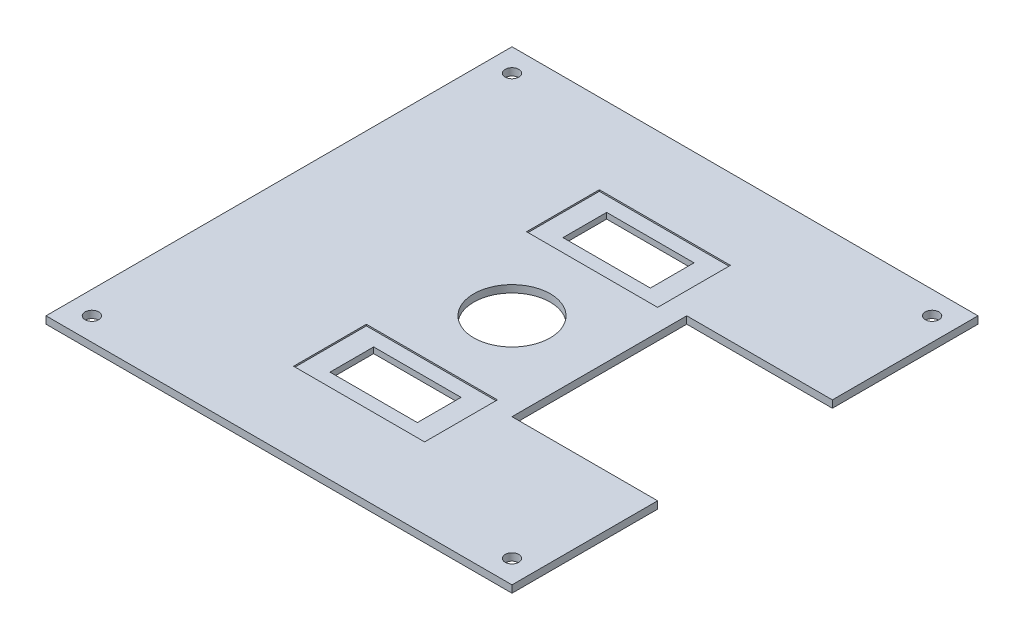
ISO-10303-21;
HEADER;
FILE_DESCRIPTION(('STEP AP214'),'2;1');
FILE_NAME('part.step','',(''),(''),'','','');
FILE_SCHEMA(('AUTOMOTIVE_DESIGN { 1 0 10303 214 1 1 1 1 }'));
ENDSEC;
DATA;
#1=APPLICATION_CONTEXT('core data for automotive mechanical design processes');
#2=APPLICATION_PROTOCOL_DEFINITION('international standard','automotive_design',2000,#1);
#3=PRODUCT_CONTEXT('',#1,'mechanical');
#4=PRODUCT('Part','Part','',(#3));
#5=PRODUCT_RELATED_PRODUCT_CATEGORY('part','',(#4));
#6=PRODUCT_DEFINITION_FORMATION('','',#4);
#7=PRODUCT_DEFINITION_CONTEXT('part definition',#1,'design');
#8=PRODUCT_DEFINITION('design','',#6,#7);
#9=PRODUCT_DEFINITION_SHAPE('','',#8);
#10=(LENGTH_UNIT() NAMED_UNIT(*) SI_UNIT(.MILLI.,.METRE.));
#11=(NAMED_UNIT(*) PLANE_ANGLE_UNIT() SI_UNIT($,.RADIAN.));
#12=(NAMED_UNIT(*) SI_UNIT($,.STERADIAN.) SOLID_ANGLE_UNIT());
#13=UNCERTAINTY_MEASURE_WITH_UNIT(LENGTH_MEASURE(1.E-05),#10,'distance_accuracy_value','');
#14=(GEOMETRIC_REPRESENTATION_CONTEXT(3) GLOBAL_UNCERTAINTY_ASSIGNED_CONTEXT((#13)) GLOBAL_UNIT_ASSIGNED_CONTEXT((#10,
#11,#12)) REPRESENTATION_CONTEXT('',''));
#15=CARTESIAN_POINT('',(0.,0.,0.));
#16=DIRECTION('',(0.,0.,1.));
#17=DIRECTION('',(1.,0.,0.));
#18=AXIS2_PLACEMENT_3D('',#15,#16,#17);
#19=CARTESIAN_POINT('',(-28.575,2.54,-34.925));
#20=DIRECTION('',(-1.,0.,0.));
#21=DIRECTION('',(0.,0.,1.));
#22=AXIS2_PLACEMENT_3D('',#19,#20,#21);
#23=PLANE('',#22);
#24=DIRECTION('',(0.,1.,0.));
#25=VECTOR('',#24,1.);
#26=CARTESIAN_POINT('',(-28.575,2.54,-34.925));
#27=LINE('',#26,#25);
#28=CARTESIAN_POINT('',(-28.575,3.175,-34.925));
#29=VERTEX_POINT('',#28);
#30=CARTESIAN_POINT('',(-28.575,2.54,-34.925));
#31=VERTEX_POINT('',#30);
#32=EDGE_CURVE('E181',#29,#31,#27,.F.);
#33=ORIENTED_EDGE('',*,*,#32,.T.);
#34=DIRECTION('',(0.,0.,-1.));
#35=VECTOR('',#34,1.);
#36=CARTESIAN_POINT('',(-28.575,2.54,0.));
#37=LINE('',#36,#35);
#38=CARTESIAN_POINT('',(-28.575,2.54,-66.675));
#39=VERTEX_POINT('',#38);
#40=EDGE_CURVE('E183',#31,#39,#37,.T.);
#41=ORIENTED_EDGE('',*,*,#40,.T.);
#42=DIRECTION('',(0.,1.,0.));
#43=VECTOR('',#42,1.);
#44=CARTESIAN_POINT('',(-28.575,2.54,-66.675));
#45=LINE('',#44,#43);
#46=CARTESIAN_POINT('',(-28.575,3.175,-66.675));
#47=VERTEX_POINT('',#46);
#48=EDGE_CURVE('E213',#39,#47,#45,.T.);
#49=ORIENTED_EDGE('',*,*,#48,.T.);
#50=DIRECTION('',(0.,0.,-1.));
#51=VECTOR('',#50,1.);
#52=CARTESIAN_POINT('',(-28.575,3.175,0.));
#53=LINE('',#52,#51);
#54=EDGE_CURVE('E186',#47,#29,#53,.F.);
#55=ORIENTED_EDGE('',*,*,#54,.T.);
#56=EDGE_LOOP('',(#33,#41,#49,#55));
#57=FACE_BOUND('',#56,.T.);
#58=ADVANCED_FACE('F17',(#57),#23,.F.);
#59=CARTESIAN_POINT('',(-28.575,2.54,-34.925));
#60=DIRECTION('',(0.,0.,1.));
#61=DIRECTION('',(1.,0.,0.));
#62=AXIS2_PLACEMENT_3D('',#59,#60,#61);
#63=PLANE('',#62);
#64=DIRECTION('',(0.,1.,0.));
#65=VECTOR('',#64,1.);
#66=CARTESIAN_POINT('',(28.575,2.54,-34.925));
#67=LINE('',#66,#65);
#68=CARTESIAN_POINT('',(28.575,3.175,-34.925));
#69=VERTEX_POINT('',#68);
#70=CARTESIAN_POINT('',(28.575,2.54,-34.925));
#71=VERTEX_POINT('',#70);
#72=EDGE_CURVE('E176',#69,#71,#67,.F.);
#73=ORIENTED_EDGE('',*,*,#72,.T.);
#74=DIRECTION('',(1.,0.,0.));
#75=VECTOR('',#74,1.);
#76=CARTESIAN_POINT('',(0.,2.54,-34.925));
#77=LINE('',#76,#75);
#78=EDGE_CURVE('E190',#71,#31,#77,.F.);
#79=ORIENTED_EDGE('',*,*,#78,.T.);
#80=ORIENTED_EDGE('',*,*,#32,.F.);
#81=DIRECTION('',(1.,0.,0.));
#82=VECTOR('',#81,1.);
#83=CARTESIAN_POINT('',(0.,3.175,-34.925));
#84=LINE('',#83,#82);
#85=EDGE_CURVE('E271',#29,#69,#84,.T.);
#86=ORIENTED_EDGE('',*,*,#85,.T.);
#87=EDGE_LOOP('',(#73,#79,#80,#86));
#88=FACE_BOUND('',#87,.T.);
#89=ADVANCED_FACE('F191',(#88),#63,.F.);
#90=CARTESIAN_POINT('',(28.575,2.54,-34.925));
#91=DIRECTION('',(1.,0.,0.));
#92=DIRECTION('',(0.,0.,-1.));
#93=AXIS2_PLACEMENT_3D('',#90,#91,#92);
#94=PLANE('',#93);
#95=DIRECTION('',(0.,1.,0.));
#96=VECTOR('',#95,1.);
#97=CARTESIAN_POINT('',(28.575,2.54,-66.675));
#98=LINE('',#97,#96);
#99=CARTESIAN_POINT('',(28.575,3.175,-66.675));
#100=VERTEX_POINT('',#99);
#101=CARTESIAN_POINT('',(28.575,2.54,-66.675));
#102=VERTEX_POINT('',#101);
#103=EDGE_CURVE('E215',#100,#102,#98,.F.);
#104=ORIENTED_EDGE('',*,*,#103,.T.);
#105=DIRECTION('',(0.,0.,-1.));
#106=VECTOR('',#105,1.);
#107=CARTESIAN_POINT('',(28.575,2.54,0.));
#108=LINE('',#107,#106);
#109=EDGE_CURVE('E202',#102,#71,#108,.F.);
#110=ORIENTED_EDGE('',*,*,#109,.T.);
#111=ORIENTED_EDGE('',*,*,#72,.F.);
#112=DIRECTION('',(0.,0.,-1.));
#113=VECTOR('',#112,1.);
#114=CARTESIAN_POINT('',(28.575,3.175,0.));
#115=LINE('',#114,#113);
#116=EDGE_CURVE('E269',#69,#100,#115,.T.);
#117=ORIENTED_EDGE('',*,*,#116,.T.);
#118=EDGE_LOOP('',(#104,#110,#111,#117));
#119=FACE_BOUND('',#118,.T.);
#120=ADVANCED_FACE('F285',(#119),#94,.F.);
#121=CARTESIAN_POINT('',(-28.575,2.54,-66.675));
#122=DIRECTION('',(0.,0.,-1.));
#123=DIRECTION('',(-1.,0.,0.));
#124=AXIS2_PLACEMENT_3D('',#121,#122,#123);
#125=PLANE('',#124);
#126=ORIENTED_EDGE('',*,*,#48,.F.);
#127=DIRECTION('',(1.,0.,0.));
#128=VECTOR('',#127,1.);
#129=CARTESIAN_POINT('',(0.,2.54,-66.675));
#130=LINE('',#129,#128);
#131=EDGE_CURVE('E200',#39,#102,#130,.T.);
#132=ORIENTED_EDGE('',*,*,#131,.T.);
#133=ORIENTED_EDGE('',*,*,#103,.F.);
#134=DIRECTION('',(1.,0.,0.));
#135=VECTOR('',#134,1.);
#136=CARTESIAN_POINT('',(0.,3.175,-66.675));
#137=LINE('',#136,#135);
#138=EDGE_CURVE('E266',#100,#47,#137,.F.);
#139=ORIENTED_EDGE('',*,*,#138,.T.);
#140=EDGE_LOOP('',(#126,#132,#133,#139));
#141=FACE_BOUND('',#140,.T.);
#142=ADVANCED_FACE('F290',(#141),#125,.F.);
#143=CARTESIAN_POINT('',(-28.575,2.54,66.675));
#144=DIRECTION('',(0.,0.,1.));
#145=DIRECTION('',(1.,0.,0.));
#146=AXIS2_PLACEMENT_3D('',#143,#144,#145);
#147=PLANE('',#146);
#148=DIRECTION('',(0.,1.,0.));
#149=VECTOR('',#148,1.);
#150=CARTESIAN_POINT('',(28.575,2.54,66.675));
#151=LINE('',#150,#149);
#152=CARTESIAN_POINT('',(28.575,3.175,66.675));
#153=VERTEX_POINT('',#152);
#154=CARTESIAN_POINT('',(28.575,2.54,66.675));
#155=VERTEX_POINT('',#154);
#156=EDGE_CURVE('E211',#153,#155,#151,.F.);
#157=ORIENTED_EDGE('',*,*,#156,.T.);
#158=DIRECTION('',(1.,0.,0.));
#159=VECTOR('',#158,1.);
#160=CARTESIAN_POINT('',(0.,2.54,66.675));
#161=LINE('',#160,#159);
#162=CARTESIAN_POINT('',(-28.575,2.54,66.675));
#163=VERTEX_POINT('',#162);
#164=EDGE_CURVE('E280',#155,#163,#161,.F.);
#165=ORIENTED_EDGE('',*,*,#164,.T.);
#166=DIRECTION('',(0.,1.,0.));
#167=VECTOR('',#166,1.);
#168=CARTESIAN_POINT('',(-28.575,2.54,66.675));
#169=LINE('',#168,#167);
#170=CARTESIAN_POINT('',(-28.575,3.175,66.675));
#171=VERTEX_POINT('',#170);
#172=EDGE_CURVE('E194',#163,#171,#169,.T.);
#173=ORIENTED_EDGE('',*,*,#172,.T.);
#174=DIRECTION('',(1.,0.,0.));
#175=VECTOR('',#174,1.);
#176=CARTESIAN_POINT('',(0.,3.175,66.675));
#177=LINE('',#176,#175);
#178=EDGE_CURVE('E264',#171,#153,#177,.T.);
#179=ORIENTED_EDGE('',*,*,#178,.T.);
#180=EDGE_LOOP('',(#157,#165,#173,#179));
#181=FACE_BOUND('',#180,.T.);
#182=ADVANCED_FACE('F508',(#181),#147,.F.);
#183=CARTESIAN_POINT('',(28.575,2.54,34.925));
#184=DIRECTION('',(1.,0.,0.));
#185=DIRECTION('',(0.,0.,-1.));
#186=AXIS2_PLACEMENT_3D('',#183,#184,#185);
#187=PLANE('',#186);
#188=DIRECTION('',(0.,1.,0.));
#189=VECTOR('',#188,1.);
#190=CARTESIAN_POINT('',(28.575,2.54,34.925));
#191=LINE('',#190,#189);
#192=CARTESIAN_POINT('',(28.575,3.175,34.925));
#193=VERTEX_POINT('',#192);
#194=CARTESIAN_POINT('',(28.575,2.54,34.925));
#195=VERTEX_POINT('',#194);
#196=EDGE_CURVE('E209',#193,#195,#191,.F.);
#197=ORIENTED_EDGE('',*,*,#196,.T.);
#198=DIRECTION('',(0.,0.,-1.));
#199=VECTOR('',#198,1.);
#200=CARTESIAN_POINT('',(28.575,2.54,0.));
#201=LINE('',#200,#199);
#202=EDGE_CURVE('E282',#195,#155,#201,.F.);
#203=ORIENTED_EDGE('',*,*,#202,.T.);
#204=ORIENTED_EDGE('',*,*,#156,.F.);
#205=DIRECTION('',(0.,0.,-1.));
#206=VECTOR('',#205,1.);
#207=CARTESIAN_POINT('',(28.575,3.175,0.));
#208=LINE('',#207,#206);
#209=EDGE_CURVE('E258',#153,#193,#208,.T.);
#210=ORIENTED_EDGE('',*,*,#209,.T.);
#211=EDGE_LOOP('',(#197,#203,#204,#210));
#212=FACE_BOUND('',#211,.T.);
#213=ADVANCED_FACE('F504',(#212),#187,.F.);
#214=CARTESIAN_POINT('',(-28.575,2.54,34.925));
#215=DIRECTION('',(0.,0.,-1.));
#216=DIRECTION('',(-1.,0.,0.));
#217=AXIS2_PLACEMENT_3D('',#214,#215,#216);
#218=PLANE('',#217);
#219=DIRECTION('',(0.,1.,0.));
#220=VECTOR('',#219,1.);
#221=CARTESIAN_POINT('',(-28.575,2.54,34.925));
#222=LINE('',#221,#220);
#223=CARTESIAN_POINT('',(-28.575,3.175,34.925));
#224=VERTEX_POINT('',#223);
#225=CARTESIAN_POINT('',(-28.575,2.54,34.925));
#226=VERTEX_POINT('',#225);
#227=EDGE_CURVE('E207',#224,#226,#222,.F.);
#228=ORIENTED_EDGE('',*,*,#227,.T.);
#229=DIRECTION('',(1.,0.,0.));
#230=VECTOR('',#229,1.);
#231=CARTESIAN_POINT('',(0.,2.54,34.925));
#232=LINE('',#231,#230);
#233=EDGE_CURVE('E274',#226,#195,#232,.T.);
#234=ORIENTED_EDGE('',*,*,#233,.T.);
#235=ORIENTED_EDGE('',*,*,#196,.F.);
#236=DIRECTION('',(1.,0.,0.));
#237=VECTOR('',#236,1.);
#238=CARTESIAN_POINT('',(0.,3.175,34.925));
#239=LINE('',#238,#237);
#240=EDGE_CURVE('E251',#193,#224,#239,.F.);
#241=ORIENTED_EDGE('',*,*,#240,.T.);
#242=EDGE_LOOP('',(#228,#234,#235,#241));
#243=FACE_BOUND('',#242,.T.);
#244=ADVANCED_FACE('F499',(#243),#218,.F.);
#245=CARTESIAN_POINT('',(-28.575,2.54,34.925));
#246=DIRECTION('',(-1.,0.,0.));
#247=DIRECTION('',(0.,0.,1.));
#248=AXIS2_PLACEMENT_3D('',#245,#246,#247);
#249=PLANE('',#248);
#250=ORIENTED_EDGE('',*,*,#172,.F.);
#251=DIRECTION('',(0.,0.,-1.));
#252=VECTOR('',#251,1.);
#253=CARTESIAN_POINT('',(-28.575,2.54,0.));
#254=LINE('',#253,#252);
#255=EDGE_CURVE('E277',#163,#226,#254,.T.);
#256=ORIENTED_EDGE('',*,*,#255,.T.);
#257=ORIENTED_EDGE('',*,*,#227,.F.);
#258=DIRECTION('',(0.,0.,-1.));
#259=VECTOR('',#258,1.);
#260=CARTESIAN_POINT('',(-28.575,3.175,0.));
#261=LINE('',#260,#259);
#262=EDGE_CURVE('E247',#224,#171,#261,.F.);
#263=ORIENTED_EDGE('',*,*,#262,.T.);
#264=EDGE_LOOP('',(#250,#256,#257,#263));
#265=FACE_BOUND('',#264,.T.);
#266=ADVANCED_FACE('F491',(#265),#249,.F.);
#267=CARTESIAN_POINT('',(0.,2.54,0.));
#268=DIRECTION('',(0.,-1.,0.));
#269=DIRECTION('',(0.,0.,-1.));
#270=AXIS2_PLACEMENT_3D('',#267,#268,#269);
#271=PLANE('',#270);
#272=ORIENTED_EDGE('',*,*,#131,.F.);
#273=ORIENTED_EDGE('',*,*,#40,.F.);
#274=ORIENTED_EDGE('',*,*,#78,.F.);
#275=ORIENTED_EDGE('',*,*,#109,.F.);
#276=EDGE_LOOP('',(#272,#273,#274,#275));
#277=FACE_BOUND('',#276,.T.);
#278=DIRECTION('',(0.,0.,-1.));
#279=VECTOR('',#278,1.);
#280=CARTESIAN_POINT('',(19.05,2.54,-41.275));
#281=LINE('',#280,#279);
#282=CARTESIAN_POINT('',(19.05,2.54,-60.325));
#283=VERTEX_POINT('',#282);
#284=CARTESIAN_POINT('',(19.05,2.54,-41.275));
#285=VERTEX_POINT('',#284);
#286=EDGE_CURVE('E239',#283,#285,#281,.F.);
#287=ORIENTED_EDGE('',*,*,#286,.T.);
#288=DIRECTION('',(1.,0.,0.));
#289=VECTOR('',#288,1.);
#290=CARTESIAN_POINT('',(-19.05,2.54,-41.275));
#291=LINE('',#290,#289);
#292=CARTESIAN_POINT('',(-19.05,2.54,-41.275));
#293=VERTEX_POINT('',#292);
#294=EDGE_CURVE('E413',#285,#293,#291,.F.);
#295=ORIENTED_EDGE('',*,*,#294,.T.);
#296=DIRECTION('',(0.,0.,1.));
#297=VECTOR('',#296,1.);
#298=CARTESIAN_POINT('',(-19.05,2.54,-41.275));
#299=LINE('',#298,#297);
#300=CARTESIAN_POINT('',(-19.05,2.54,-60.325));
#301=VERTEX_POINT('',#300);
#302=EDGE_CURVE('E484',#293,#301,#299,.F.);
#303=ORIENTED_EDGE('',*,*,#302,.T.);
#304=DIRECTION('',(-1.,0.,0.));
#305=VECTOR('',#304,1.);
#306=CARTESIAN_POINT('',(-19.05,2.54,-60.325));
#307=LINE('',#306,#305);
#308=EDGE_CURVE('E486',#301,#283,#307,.F.);
#309=ORIENTED_EDGE('',*,*,#308,.T.);
#310=EDGE_LOOP('',(#287,#295,#303,#309));
#311=FACE_BOUND('',#310,.T.);
#312=ADVANCED_FACE('F197',(#277,#311),#271,.F.);
#313=CARTESIAN_POINT('',(0.,2.54,0.));
#314=DIRECTION('',(0.,-1.,0.));
#315=DIRECTION('',(0.,0.,-1.));
#316=AXIS2_PLACEMENT_3D('',#313,#314,#315);
#317=PLANE('',#316);
#318=ORIENTED_EDGE('',*,*,#255,.F.);
#319=ORIENTED_EDGE('',*,*,#164,.F.);
#320=ORIENTED_EDGE('',*,*,#202,.F.);
#321=ORIENTED_EDGE('',*,*,#233,.F.);
#322=EDGE_LOOP('',(#318,#319,#320,#321));
#323=FACE_BOUND('',#322,.T.);
#324=DIRECTION('',(-1.,0.,0.));
#325=VECTOR('',#324,1.);
#326=CARTESIAN_POINT('',(-19.05,2.54,41.275));
#327=LINE('',#326,#325);
#328=CARTESIAN_POINT('',(-19.05,2.54,41.275));
#329=VERTEX_POINT('',#328);
#330=CARTESIAN_POINT('',(19.05,2.54,41.275));
#331=VERTEX_POINT('',#330);
#332=EDGE_CURVE('E414',#329,#331,#327,.F.);
#333=ORIENTED_EDGE('',*,*,#332,.T.);
#334=DIRECTION('',(0.,0.,-1.));
#335=VECTOR('',#334,1.);
#336=CARTESIAN_POINT('',(19.05,2.54,41.275));
#337=LINE('',#336,#335);
#338=CARTESIAN_POINT('',(19.05,2.54,60.3250000000001));
#339=VERTEX_POINT('',#338);
#340=EDGE_CURVE('E469',#331,#339,#337,.F.);
#341=ORIENTED_EDGE('',*,*,#340,.T.);
#342=DIRECTION('',(1.,0.,0.));
#343=VECTOR('',#342,1.);
#344=CARTESIAN_POINT('',(-19.05,2.54,60.3250000000001));
#345=LINE('',#344,#343);
#346=CARTESIAN_POINT('',(-19.05,2.54,60.3250000000001));
#347=VERTEX_POINT('',#346);
#348=EDGE_CURVE('E473',#339,#347,#345,.F.);
#349=ORIENTED_EDGE('',*,*,#348,.T.);
#350=DIRECTION('',(0.,0.,1.));
#351=VECTOR('',#350,1.);
#352=CARTESIAN_POINT('',(-19.05,2.54,41.275));
#353=LINE('',#352,#351);
#354=EDGE_CURVE('E477',#347,#329,#353,.F.);
#355=ORIENTED_EDGE('',*,*,#354,.T.);
#356=EDGE_LOOP('',(#333,#341,#349,#355));
#357=FACE_BOUND('',#356,.T.);
#358=ADVANCED_FACE('F296',(#323,#357),#317,.F.);
#359=CARTESIAN_POINT('',(0.,3.175,0.));
#360=DIRECTION('',(0.,-1.,0.));
#361=DIRECTION('',(0.,0.,-1.));
#362=AXIS2_PLACEMENT_3D('',#359,#360,#361);
#363=PLANE('',#362);
#364=CARTESIAN_POINT('',(0.,3.175,0.));
#365=DIRECTION('',(0.,-1.,0.));
#366=DIRECTION('',(0.,0.,-1.));
#367=AXIS2_PLACEMENT_3D('',#364,#365,#366);
#368=CIRCLE('',#367,16.66875);
#369=CARTESIAN_POINT('',(0.,3.175,-16.66875));
#370=VERTEX_POINT('',#369);
#371=EDGE_CURVE('E231',#370,#370,#368,.T.);
#372=ORIENTED_EDGE('',*,*,#371,.T.);
#373=EDGE_LOOP('',(#372));
#374=FACE_BOUND('',#373,.T.);
#375=DIRECTION('',(-1.,0.,0.));
#376=VECTOR('',#375,1.);
#377=CARTESIAN_POINT('',(38.1,3.175,-38.1));
#378=LINE('',#377,#376);
#379=CARTESIAN_POINT('',(38.1,3.175,-38.1));
#380=VERTEX_POINT('',#379);
#381=CARTESIAN_POINT('',(101.6,3.175,-38.1));
#382=VERTEX_POINT('',#381);
#383=EDGE_CURVE('E462',#380,#382,#378,.F.);
#384=ORIENTED_EDGE('',*,*,#383,.T.);
#385=DIRECTION('',(0.,0.,1.));
#386=VECTOR('',#385,1.);
#387=CARTESIAN_POINT('',(101.6,3.175,101.6));
#388=LINE('',#387,#386);
#389=CARTESIAN_POINT('',(101.6,3.175,-101.6));
#390=VERTEX_POINT('',#389);
#391=EDGE_CURVE('E235',#382,#390,#388,.F.);
#392=ORIENTED_EDGE('',*,*,#391,.T.);
#393=DIRECTION('',(1.,0.,0.));
#394=VECTOR('',#393,1.);
#395=CARTESIAN_POINT('',(-101.6,3.175,-101.6));
#396=LINE('',#395,#394);
#397=CARTESIAN_POINT('',(-101.6,3.175,-101.6));
#398=VERTEX_POINT('',#397);
#399=EDGE_CURVE('E437',#390,#398,#396,.F.);
#400=ORIENTED_EDGE('',*,*,#399,.T.);
#401=DIRECTION('',(0.,0.,-1.));
#402=VECTOR('',#401,1.);
#403=CARTESIAN_POINT('',(-101.6,3.175,101.6));
#404=LINE('',#403,#402);
#405=CARTESIAN_POINT('',(-101.6,3.175,101.6));
#406=VERTEX_POINT('',#405);
#407=EDGE_CURVE('E441',#398,#406,#404,.F.);
#408=ORIENTED_EDGE('',*,*,#407,.T.);
#409=DIRECTION('',(-1.,0.,0.));
#410=VECTOR('',#409,1.);
#411=CARTESIAN_POINT('',(-101.6,3.175,101.6));
#412=LINE('',#411,#410);
#413=CARTESIAN_POINT('',(101.6,3.175,101.6));
#414=VERTEX_POINT('',#413);
#415=EDGE_CURVE('E445',#406,#414,#412,.F.);
#416=ORIENTED_EDGE('',*,*,#415,.T.);
#417=DIRECTION('',(0.,0.,1.));
#418=VECTOR('',#417,1.);
#419=CARTESIAN_POINT('',(101.6,3.175,101.6));
#420=LINE('',#419,#418);
#421=CARTESIAN_POINT('',(101.6,3.175,38.1));
#422=VERTEX_POINT('',#421);
#423=EDGE_CURVE('E449',#414,#422,#420,.F.);
#424=ORIENTED_EDGE('',*,*,#423,.T.);
#425=DIRECTION('',(1.,0.,0.));
#426=VECTOR('',#425,1.);
#427=CARTESIAN_POINT('',(101.6,3.175,38.1));
#428=LINE('',#427,#426);
#429=CARTESIAN_POINT('',(38.1,3.175,38.1));
#430=VERTEX_POINT('',#429);
#431=EDGE_CURVE('E451',#422,#430,#428,.F.);
#432=ORIENTED_EDGE('',*,*,#431,.T.);
#433=DIRECTION('',(0.,0.,1.));
#434=VECTOR('',#433,1.);
#435=CARTESIAN_POINT('',(38.1,3.175,38.1));
#436=LINE('',#435,#434);
#437=EDGE_CURVE('E456',#430,#380,#436,.F.);
#438=ORIENTED_EDGE('',*,*,#437,.T.);
#439=EDGE_LOOP('',(#384,#392,#400,#408,#416,#424,#432,#438));
#440=FACE_BOUND('',#439,.T.);
#441=ORIENTED_EDGE('',*,*,#240,.F.);
#442=ORIENTED_EDGE('',*,*,#209,.F.);
#443=ORIENTED_EDGE('',*,*,#178,.F.);
#444=ORIENTED_EDGE('',*,*,#262,.F.);
#445=EDGE_LOOP('',(#441,#442,#443,#444));
#446=FACE_BOUND('',#445,.T.);
#447=ORIENTED_EDGE('',*,*,#116,.F.);
#448=ORIENTED_EDGE('',*,*,#85,.F.);
#449=ORIENTED_EDGE('',*,*,#54,.F.);
#450=ORIENTED_EDGE('',*,*,#138,.F.);
#451=EDGE_LOOP('',(#447,#448,#449,#450));
#452=FACE_BOUND('',#451,.T.);
#453=CARTESIAN_POINT('',(-91.6,3.175,-91.6));
#454=DIRECTION('',(0.,1.,0.));
#455=DIRECTION('',(0.,0.,1.));
#456=AXIS2_PLACEMENT_3D('',#453,#454,#455);
#457=CIRCLE('',#456,2.97688);
#458=CARTESIAN_POINT('',(-91.6,3.175,-88.62312));
#459=VERTEX_POINT('',#458);
#460=EDGE_CURVE('E236',#459,#459,#457,.F.);
#461=ORIENTED_EDGE('',*,*,#460,.T.);
#462=EDGE_LOOP('',(#461));
#463=FACE_BOUND('',#462,.T.);
#464=CARTESIAN_POINT('',(91.5999999999993,3.175,-91.6000000000007));
#465=DIRECTION('',(0.,1.,0.));
#466=DIRECTION('',(0.,0.,1.));
#467=AXIS2_PLACEMENT_3D('',#464,#465,#466);
#468=CIRCLE('',#467,2.97688);
#469=CARTESIAN_POINT('',(91.5999999999993,3.175,-88.6231200000007));
#470=VERTEX_POINT('',#469);
#471=EDGE_CURVE('E240',#470,#470,#468,.F.);
#472=ORIENTED_EDGE('',*,*,#471,.T.);
#473=EDGE_LOOP('',(#472));
#474=FACE_BOUND('',#473,.T.);
#475=CARTESIAN_POINT('',(91.5999999999993,3.175,91.6000000000007));
#476=DIRECTION('',(0.,1.,0.));
#477=DIRECTION('',(0.,0.,1.));
#478=AXIS2_PLACEMENT_3D('',#475,#476,#477);
#479=CIRCLE('',#478,2.97688);
#480=CARTESIAN_POINT('',(91.5999999999993,3.175,94.5768800000007));
#481=VERTEX_POINT('',#480);
#482=EDGE_CURVE('E242',#481,#481,#479,.F.);
#483=ORIENTED_EDGE('',*,*,#482,.T.);
#484=EDGE_LOOP('',(#483));
#485=FACE_BOUND('',#484,.T.);
#486=CARTESIAN_POINT('',(-91.6,3.175,91.6000000000001));
#487=DIRECTION('',(0.,1.,0.));
#488=DIRECTION('',(0.,0.,1.));
#489=AXIS2_PLACEMENT_3D('',#486,#487,#488);
#490=CIRCLE('',#489,2.97688);
#491=CARTESIAN_POINT('',(-91.6,3.175,94.5768800000001));
#492=VERTEX_POINT('',#491);
#493=EDGE_CURVE('E20',#492,#492,#490,.F.);
#494=ORIENTED_EDGE('',*,*,#493,.T.);
#495=EDGE_LOOP('',(#494));
#496=FACE_BOUND('',#495,.T.);
#497=ADVANCED_FACE('F292',(#374,#440,#446,#452,#463,#474,#485,#496),#363,.F.);
#498=CARTESIAN_POINT('',(-91.6,-34.925,91.6000000000001));
#499=DIRECTION('',(0.,1.,0.));
#500=DIRECTION('',(0.,0.,1.));
#501=AXIS2_PLACEMENT_3D('',#498,#499,#500);
#502=CYLINDRICAL_SURFACE('',#501,2.97688);
#503=CARTESIAN_POINT('',(-91.6,0.,91.6000000000001));
#504=DIRECTION('',(0.,1.,0.));
#505=DIRECTION('',(0.,0.,1.));
#506=AXIS2_PLACEMENT_3D('',#503,#504,#505);
#507=CIRCLE('',#506,2.97688);
#508=CARTESIAN_POINT('',(-91.6,0.,94.5768800000001));
#509=VERTEX_POINT('',#508);
#510=EDGE_CURVE('E228',#509,#509,#507,.T.);
#511=ORIENTED_EDGE('',*,*,#510,.F.);
#512=EDGE_LOOP('',(#511));
#513=FACE_BOUND('',#512,.T.);
#514=ORIENTED_EDGE('',*,*,#493,.F.);
#515=EDGE_LOOP('',(#514));
#516=FACE_BOUND('',#515,.T.);
#517=ADVANCED_FACE('F295',(#513,#516),#502,.F.);
#518=CARTESIAN_POINT('',(91.5999999999993,-34.925,91.6000000000007));
#519=DIRECTION('',(0.,1.,0.));
#520=DIRECTION('',(0.,0.,1.));
#521=AXIS2_PLACEMENT_3D('',#518,#519,#520);
#522=CYLINDRICAL_SURFACE('',#521,2.97688);
#523=CARTESIAN_POINT('',(91.5999999999993,0.,91.6000000000007));
#524=DIRECTION('',(0.,1.,0.));
#525=DIRECTION('',(0.,0.,1.));
#526=AXIS2_PLACEMENT_3D('',#523,#524,#525);
#527=CIRCLE('',#526,2.97688);
#528=CARTESIAN_POINT('',(91.5999999999993,0.,94.5768800000007));
#529=VERTEX_POINT('',#528);
#530=EDGE_CURVE('E225',#529,#529,#527,.T.);
#531=ORIENTED_EDGE('',*,*,#530,.F.);
#532=EDGE_LOOP('',(#531));
#533=FACE_BOUND('',#532,.T.);
#534=ORIENTED_EDGE('',*,*,#482,.F.);
#535=EDGE_LOOP('',(#534));
#536=FACE_BOUND('',#535,.T.);
#537=ADVANCED_FACE('F306',(#533,#536),#522,.F.);
#538=CARTESIAN_POINT('',(91.5999999999993,-34.925,-91.6000000000007));
#539=DIRECTION('',(0.,1.,0.));
#540=DIRECTION('',(0.,0.,1.));
#541=AXIS2_PLACEMENT_3D('',#538,#539,#540);
#542=CYLINDRICAL_SURFACE('',#541,2.97688);
#543=CARTESIAN_POINT('',(91.5999999999993,0.,-91.6000000000007));
#544=DIRECTION('',(0.,1.,0.));
#545=DIRECTION('',(0.,0.,1.));
#546=AXIS2_PLACEMENT_3D('',#543,#544,#545);
#547=CIRCLE('',#546,2.97688);
#548=CARTESIAN_POINT('',(91.5999999999993,0.,-88.6231200000007));
#549=VERTEX_POINT('',#548);
#550=EDGE_CURVE('E222',#549,#549,#547,.T.);
#551=ORIENTED_EDGE('',*,*,#550,.F.);
#552=EDGE_LOOP('',(#551));
#553=FACE_BOUND('',#552,.T.);
#554=ORIENTED_EDGE('',*,*,#471,.F.);
#555=EDGE_LOOP('',(#554));
#556=FACE_BOUND('',#555,.T.);
#557=ADVANCED_FACE('F303',(#553,#556),#542,.F.);
#558=CARTESIAN_POINT('',(-91.6,-34.925,-91.6));
#559=DIRECTION('',(0.,1.,0.));
#560=DIRECTION('',(0.,0.,1.));
#561=AXIS2_PLACEMENT_3D('',#558,#559,#560);
#562=CYLINDRICAL_SURFACE('',#561,2.97688);
#563=CARTESIAN_POINT('',(-91.6,0.,-91.6));
#564=DIRECTION('',(0.,1.,0.));
#565=DIRECTION('',(0.,0.,1.));
#566=AXIS2_PLACEMENT_3D('',#563,#564,#565);
#567=CIRCLE('',#566,2.97688);
#568=CARTESIAN_POINT('',(-91.6,0.,-88.62312));
#569=VERTEX_POINT('',#568);
#570=EDGE_CURVE('E218',#569,#569,#567,.T.);
#571=ORIENTED_EDGE('',*,*,#570,.F.);
#572=EDGE_LOOP('',(#571));
#573=FACE_BOUND('',#572,.T.);
#574=ORIENTED_EDGE('',*,*,#460,.F.);
#575=EDGE_LOOP('',(#574));
#576=FACE_BOUND('',#575,.T.);
#577=ADVANCED_FACE('F305',(#573,#576),#562,.F.);
#578=CARTESIAN_POINT('',(19.05,0.,-41.275));
#579=DIRECTION('',(1.,0.,0.));
#580=DIRECTION('',(0.,0.,-1.));
#581=AXIS2_PLACEMENT_3D('',#578,#579,#580);
#582=PLANE('',#581);
#583=DIRECTION('',(0.,0.,-1.));
#584=VECTOR('',#583,1.);
#585=CARTESIAN_POINT('',(19.05,0.,0.));
#586=LINE('',#585,#584);
#587=CARTESIAN_POINT('',(19.05,0.,-41.275));
#588=VERTEX_POINT('',#587);
#589=CARTESIAN_POINT('',(19.05,0.,-60.325));
#590=VERTEX_POINT('',#589);
#591=EDGE_CURVE('E221',#588,#590,#586,.T.);
#592=ORIENTED_EDGE('',*,*,#591,.F.);
#593=DIRECTION('',(0.,1.,0.));
#594=VECTOR('',#593,1.);
#595=CARTESIAN_POINT('',(19.05,0.,-41.275));
#596=LINE('',#595,#594);
#597=EDGE_CURVE('E399',#588,#285,#596,.T.);
#598=ORIENTED_EDGE('',*,*,#597,.T.);
#599=ORIENTED_EDGE('',*,*,#286,.F.);
#600=DIRECTION('',(0.,1.,0.));
#601=VECTOR('',#600,1.);
#602=CARTESIAN_POINT('',(19.05,0.,-60.325));
#603=LINE('',#602,#601);
#604=EDGE_CURVE('E402',#283,#590,#603,.F.);
#605=ORIENTED_EDGE('',*,*,#604,.T.);
#606=EDGE_LOOP('',(#592,#598,#599,#605));
#607=FACE_BOUND('',#606,.T.);
#608=ADVANCED_FACE('F314',(#607),#582,.F.);
#609=CARTESIAN_POINT('',(-19.05,0.,-60.325));
#610=DIRECTION('',(0.,0.,-1.));
#611=DIRECTION('',(-1.,0.,0.));
#612=AXIS2_PLACEMENT_3D('',#609,#610,#611);
#613=PLANE('',#612);
#614=DIRECTION('',(1.,0.,0.));
#615=VECTOR('',#614,1.);
#616=CARTESIAN_POINT('',(0.,0.,-60.325));
#617=LINE('',#616,#615);
#618=CARTESIAN_POINT('',(-19.05,0.,-60.325));
#619=VERTEX_POINT('',#618);
#620=EDGE_CURVE('E407',#590,#619,#617,.F.);
#621=ORIENTED_EDGE('',*,*,#620,.F.);
#622=ORIENTED_EDGE('',*,*,#604,.F.);
#623=ORIENTED_EDGE('',*,*,#308,.F.);
#624=DIRECTION('',(0.,1.,0.));
#625=VECTOR('',#624,1.);
#626=CARTESIAN_POINT('',(-19.05,0.,-60.325));
#627=LINE('',#626,#625);
#628=EDGE_CURVE('E482',#301,#619,#627,.F.);
#629=ORIENTED_EDGE('',*,*,#628,.T.);
#630=EDGE_LOOP('',(#621,#622,#623,#629));
#631=FACE_BOUND('',#630,.T.);
#632=ADVANCED_FACE('F386',(#631),#613,.F.);
#633=CARTESIAN_POINT('',(-19.05,0.,-41.275));
#634=DIRECTION('',(-1.,0.,0.));
#635=DIRECTION('',(0.,0.,1.));
#636=AXIS2_PLACEMENT_3D('',#633,#634,#635);
#637=PLANE('',#636);
#638=DIRECTION('',(0.,0.,-1.));
#639=VECTOR('',#638,1.);
#640=CARTESIAN_POINT('',(-19.05,0.,0.));
#641=LINE('',#640,#639);
#642=CARTESIAN_POINT('',(-19.05,0.,-41.275));
#643=VERTEX_POINT('',#642);
#644=EDGE_CURVE('E419',#619,#643,#641,.F.);
#645=ORIENTED_EDGE('',*,*,#644,.F.);
#646=ORIENTED_EDGE('',*,*,#628,.F.);
#647=ORIENTED_EDGE('',*,*,#302,.F.);
#648=DIRECTION('',(0.,1.,0.));
#649=VECTOR('',#648,1.);
#650=CARTESIAN_POINT('',(-19.05,0.,-41.275));
#651=LINE('',#650,#649);
#652=EDGE_CURVE('E415',#293,#643,#651,.F.);
#653=ORIENTED_EDGE('',*,*,#652,.T.);
#654=EDGE_LOOP('',(#645,#646,#647,#653));
#655=FACE_BOUND('',#654,.T.);
#656=ADVANCED_FACE('F382',(#655),#637,.F.);
#657=CARTESIAN_POINT('',(-19.05,0.,-41.275));
#658=DIRECTION('',(0.,0.,1.));
#659=DIRECTION('',(1.,0.,0.));
#660=AXIS2_PLACEMENT_3D('',#657,#658,#659);
#661=PLANE('',#660);
#662=DIRECTION('',(1.,0.,0.));
#663=VECTOR('',#662,1.);
#664=CARTESIAN_POINT('',(0.,0.,-41.275));
#665=LINE('',#664,#663);
#666=EDGE_CURVE('E411',#643,#588,#665,.T.);
#667=ORIENTED_EDGE('',*,*,#666,.F.);
#668=ORIENTED_EDGE('',*,*,#652,.F.);
#669=ORIENTED_EDGE('',*,*,#294,.F.);
#670=ORIENTED_EDGE('',*,*,#597,.F.);
#671=EDGE_LOOP('',(#667,#668,#669,#670));
#672=FACE_BOUND('',#671,.T.);
#673=ADVANCED_FACE('F378',(#672),#661,.F.);
#674=CARTESIAN_POINT('',(-19.05,0.,41.275));
#675=DIRECTION('',(0.,0.,-1.));
#676=DIRECTION('',(-1.,0.,0.));
#677=AXIS2_PLACEMENT_3D('',#674,#675,#676);
#678=PLANE('',#677);
#679=DIRECTION('',(1.,0.,0.));
#680=VECTOR('',#679,1.);
#681=CARTESIAN_POINT('',(0.,0.,41.275));
#682=LINE('',#681,#680);
#683=CARTESIAN_POINT('',(19.05,0.,41.275));
#684=VERTEX_POINT('',#683);
#685=CARTESIAN_POINT('',(-19.05,0.,41.275));
#686=VERTEX_POINT('',#685);
#687=EDGE_CURVE('E420',#684,#686,#682,.F.);
#688=ORIENTED_EDGE('',*,*,#687,.F.);
#689=DIRECTION('',(0.,1.,0.));
#690=VECTOR('',#689,1.);
#691=CARTESIAN_POINT('',(19.05,0.,41.275));
#692=LINE('',#691,#690);
#693=EDGE_CURVE('E464',#684,#331,#692,.T.);
#694=ORIENTED_EDGE('',*,*,#693,.T.);
#695=ORIENTED_EDGE('',*,*,#332,.F.);
#696=DIRECTION('',(0.,1.,0.));
#697=VECTOR('',#696,1.);
#698=CARTESIAN_POINT('',(-19.05,0.,41.275));
#699=LINE('',#698,#697);
#700=EDGE_CURVE('E475',#329,#686,#699,.F.);
#701=ORIENTED_EDGE('',*,*,#700,.T.);
#702=EDGE_LOOP('',(#688,#694,#695,#701));
#703=FACE_BOUND('',#702,.T.);
#704=ADVANCED_FACE('F374',(#703),#678,.F.);
#705=CARTESIAN_POINT('',(-19.05,0.,41.275));
#706=DIRECTION('',(-1.,0.,0.));
#707=DIRECTION('',(0.,0.,1.));
#708=AXIS2_PLACEMENT_3D('',#705,#706,#707);
#709=PLANE('',#708);
#710=DIRECTION('',(0.,0.,-1.));
#711=VECTOR('',#710,1.);
#712=CARTESIAN_POINT('',(-19.05,0.,0.));
#713=LINE('',#712,#711);
#714=CARTESIAN_POINT('',(-19.05,0.,60.3250000000001));
#715=VERTEX_POINT('',#714);
#716=EDGE_CURVE('E423',#686,#715,#713,.F.);
#717=ORIENTED_EDGE('',*,*,#716,.F.);
#718=ORIENTED_EDGE('',*,*,#700,.F.);
#719=ORIENTED_EDGE('',*,*,#354,.F.);
#720=DIRECTION('',(0.,1.,0.));
#721=VECTOR('',#720,1.);
#722=CARTESIAN_POINT('',(-19.05,0.,60.3250000000001));
#723=LINE('',#722,#721);
#724=EDGE_CURVE('E471',#347,#715,#723,.F.);
#725=ORIENTED_EDGE('',*,*,#724,.T.);
#726=EDGE_LOOP('',(#717,#718,#719,#725));
#727=FACE_BOUND('',#726,.T.);
#728=ADVANCED_FACE('F370',(#727),#709,.F.);
#729=CARTESIAN_POINT('',(-19.05,0.,60.3250000000001));
#730=DIRECTION('',(0.,0.,1.));
#731=DIRECTION('',(1.,0.,0.));
#732=AXIS2_PLACEMENT_3D('',#729,#730,#731);
#733=PLANE('',#732);
#734=DIRECTION('',(1.,0.,0.));
#735=VECTOR('',#734,1.);
#736=CARTESIAN_POINT('',(0.,0.,60.3250000000001));
#737=LINE('',#736,#735);
#738=CARTESIAN_POINT('',(19.05,0.,60.3250000000001));
#739=VERTEX_POINT('',#738);
#740=EDGE_CURVE('E754',#715,#739,#737,.T.);
#741=ORIENTED_EDGE('',*,*,#740,.F.);
#742=ORIENTED_EDGE('',*,*,#724,.F.);
#743=ORIENTED_EDGE('',*,*,#348,.F.);
#744=DIRECTION('',(0.,1.,0.));
#745=VECTOR('',#744,1.);
#746=CARTESIAN_POINT('',(19.05,0.,60.3250000000001));
#747=LINE('',#746,#745);
#748=EDGE_CURVE('E467',#339,#739,#747,.F.);
#749=ORIENTED_EDGE('',*,*,#748,.T.);
#750=EDGE_LOOP('',(#741,#742,#743,#749));
#751=FACE_BOUND('',#750,.T.);
#752=ADVANCED_FACE('F366',(#751),#733,.F.);
#753=CARTESIAN_POINT('',(19.05,0.,41.275));
#754=DIRECTION('',(1.,0.,0.));
#755=DIRECTION('',(0.,0.,-1.));
#756=AXIS2_PLACEMENT_3D('',#753,#754,#755);
#757=PLANE('',#756);
#758=DIRECTION('',(0.,0.,-1.));
#759=VECTOR('',#758,1.);
#760=CARTESIAN_POINT('',(19.05,0.,0.));
#761=LINE('',#760,#759);
#762=EDGE_CURVE('E750',#739,#684,#761,.T.);
#763=ORIENTED_EDGE('',*,*,#762,.F.);
#764=ORIENTED_EDGE('',*,*,#748,.F.);
#765=ORIENTED_EDGE('',*,*,#340,.F.);
#766=ORIENTED_EDGE('',*,*,#693,.F.);
#767=EDGE_LOOP('',(#763,#764,#765,#766));
#768=FACE_BOUND('',#767,.T.);
#769=ADVANCED_FACE('F362',(#768),#757,.F.);
#770=CARTESIAN_POINT('',(38.1,0.,-38.1));
#771=DIRECTION('',(0.,0.,-1.));
#772=DIRECTION('',(-1.,0.,0.));
#773=AXIS2_PLACEMENT_3D('',#770,#771,#772);
#774=PLANE('',#773);
#775=DIRECTION('',(0.,1.,0.));
#776=VECTOR('',#775,1.);
#777=CARTESIAN_POINT('',(38.1,0.,-38.1));
#778=LINE('',#777,#776);
#779=CARTESIAN_POINT('',(38.1,0.,-38.1));
#780=VERTEX_POINT('',#779);
#781=EDGE_CURVE('E460',#380,#780,#778,.F.);
#782=ORIENTED_EDGE('',*,*,#781,.T.);
#783=DIRECTION('',(1.,0.,0.));
#784=VECTOR('',#783,1.);
#785=CARTESIAN_POINT('',(0.,0.,-38.1));
#786=LINE('',#785,#784);
#787=CARTESIAN_POINT('',(101.6,0.,-38.1));
#788=VERTEX_POINT('',#787);
#789=EDGE_CURVE('E758',#788,#780,#786,.F.);
#790=ORIENTED_EDGE('',*,*,#789,.F.);
#791=DIRECTION('',(0.,1.,0.));
#792=VECTOR('',#791,1.);
#793=CARTESIAN_POINT('',(101.6,3.175,-38.1));
#794=LINE('',#793,#792);
#795=EDGE_CURVE('E431',#788,#382,#794,.T.);
#796=ORIENTED_EDGE('',*,*,#795,.T.);
#797=ORIENTED_EDGE('',*,*,#383,.F.);
#798=EDGE_LOOP('',(#782,#790,#796,#797));
#799=FACE_BOUND('',#798,.T.);
#800=ADVANCED_FACE('F358',(#799),#774,.F.);
#801=CARTESIAN_POINT('',(38.1,0.,38.1));
#802=DIRECTION('',(-1.,0.,0.));
#803=DIRECTION('',(0.,0.,1.));
#804=AXIS2_PLACEMENT_3D('',#801,#802,#803);
#805=PLANE('',#804);
#806=DIRECTION('',(0.,1.,0.));
#807=VECTOR('',#806,1.);
#808=CARTESIAN_POINT('',(38.1,0.,38.1));
#809=LINE('',#808,#807);
#810=CARTESIAN_POINT('',(38.1,0.,38.1));
#811=VERTEX_POINT('',#810);
#812=EDGE_CURVE('E454',#430,#811,#809,.F.);
#813=ORIENTED_EDGE('',*,*,#812,.T.);
#814=DIRECTION('',(0.,0.,-1.));
#815=VECTOR('',#814,1.);
#816=CARTESIAN_POINT('',(38.1,0.,0.));
#817=LINE('',#816,#815);
#818=EDGE_CURVE('E761',#780,#811,#817,.F.);
#819=ORIENTED_EDGE('',*,*,#818,.F.);
#820=ORIENTED_EDGE('',*,*,#781,.F.);
#821=ORIENTED_EDGE('',*,*,#437,.F.);
#822=EDGE_LOOP('',(#813,#819,#820,#821));
#823=FACE_BOUND('',#822,.T.);
#824=ADVANCED_FACE('F354',(#823),#805,.F.);
#825=CARTESIAN_POINT('',(101.6,0.,38.1));
#826=DIRECTION('',(0.,0.,1.));
#827=DIRECTION('',(1.,0.,0.));
#828=AXIS2_PLACEMENT_3D('',#825,#826,#827);
#829=PLANE('',#828);
#830=DIRECTION('',(0.,1.,0.));
#831=VECTOR('',#830,1.);
#832=CARTESIAN_POINT('',(101.6,3.175,38.1));
#833=LINE('',#832,#831);
#834=CARTESIAN_POINT('',(101.6,0.,38.1));
#835=VERTEX_POINT('',#834);
#836=EDGE_CURVE('E447',#422,#835,#833,.F.);
#837=ORIENTED_EDGE('',*,*,#836,.T.);
#838=DIRECTION('',(1.,0.,0.));
#839=VECTOR('',#838,1.);
#840=CARTESIAN_POINT('',(0.,0.,38.1));
#841=LINE('',#840,#839);
#842=EDGE_CURVE('E768',#811,#835,#841,.T.);
#843=ORIENTED_EDGE('',*,*,#842,.F.);
#844=ORIENTED_EDGE('',*,*,#812,.F.);
#845=ORIENTED_EDGE('',*,*,#431,.F.);
#846=EDGE_LOOP('',(#837,#843,#844,#845));
#847=FACE_BOUND('',#846,.T.);
#848=ADVANCED_FACE('F350',(#847),#829,.F.);
#849=CARTESIAN_POINT('',(101.6,3.175,101.6));
#850=DIRECTION('',(-1.,0.,0.));
#851=DIRECTION('',(0.,0.,1.));
#852=AXIS2_PLACEMENT_3D('',#849,#850,#851);
#853=PLANE('',#852);
#854=ORIENTED_EDGE('',*,*,#836,.F.);
#855=ORIENTED_EDGE('',*,*,#423,.F.);
#856=DIRECTION('',(0.,1.,0.));
#857=VECTOR('',#856,1.);
#858=CARTESIAN_POINT('',(101.6,3.175,101.6));
#859=LINE('',#858,#857);
#860=CARTESIAN_POINT('',(101.6,0.,101.6));
#861=VERTEX_POINT('',#860);
#862=EDGE_CURVE('E443',#414,#861,#859,.F.);
#863=ORIENTED_EDGE('',*,*,#862,.T.);
#864=DIRECTION('',(0.,0.,-1.));
#865=VECTOR('',#864,1.);
#866=CARTESIAN_POINT('',(101.6,0.,0.));
#867=LINE('',#866,#865);
#868=EDGE_CURVE('E771',#835,#861,#867,.F.);
#869=ORIENTED_EDGE('',*,*,#868,.F.);
#870=EDGE_LOOP('',(#854,#855,#863,#869));
#871=FACE_BOUND('',#870,.T.);
#872=ADVANCED_FACE('F346',(#871),#853,.F.);
#873=CARTESIAN_POINT('',(-101.6,3.175,101.6));
#874=DIRECTION('',(0.,0.,-1.));
#875=DIRECTION('',(-1.,0.,0.));
#876=AXIS2_PLACEMENT_3D('',#873,#874,#875);
#877=PLANE('',#876);
#878=ORIENTED_EDGE('',*,*,#862,.F.);
#879=ORIENTED_EDGE('',*,*,#415,.F.);
#880=DIRECTION('',(0.,1.,0.));
#881=VECTOR('',#880,1.);
#882=CARTESIAN_POINT('',(-101.6,3.175,101.6));
#883=LINE('',#882,#881);
#884=CARTESIAN_POINT('',(-101.6,0.,101.6));
#885=VERTEX_POINT('',#884);
#886=EDGE_CURVE('E439',#406,#885,#883,.F.);
#887=ORIENTED_EDGE('',*,*,#886,.T.);
#888=DIRECTION('',(1.,0.,0.));
#889=VECTOR('',#888,1.);
#890=CARTESIAN_POINT('',(0.,0.,101.6));
#891=LINE('',#890,#889);
#892=EDGE_CURVE('E774',#861,#885,#891,.F.);
#893=ORIENTED_EDGE('',*,*,#892,.F.);
#894=EDGE_LOOP('',(#878,#879,#887,#893));
#895=FACE_BOUND('',#894,.T.);
#896=ADVANCED_FACE('F342',(#895),#877,.F.);
#897=CARTESIAN_POINT('',(-101.6,3.175,101.6));
#898=DIRECTION('',(1.,0.,0.));
#899=DIRECTION('',(0.,0.,-1.));
#900=AXIS2_PLACEMENT_3D('',#897,#898,#899);
#901=PLANE('',#900);
#902=ORIENTED_EDGE('',*,*,#886,.F.);
#903=ORIENTED_EDGE('',*,*,#407,.F.);
#904=DIRECTION('',(0.,1.,0.));
#905=VECTOR('',#904,1.);
#906=CARTESIAN_POINT('',(-101.6,3.175,-101.6));
#907=LINE('',#906,#905);
#908=CARTESIAN_POINT('',(-101.6,0.,-101.6));
#909=VERTEX_POINT('',#908);
#910=EDGE_CURVE('E435',#398,#909,#907,.F.);
#911=ORIENTED_EDGE('',*,*,#910,.T.);
#912=DIRECTION('',(0.,0.,-1.));
#913=VECTOR('',#912,1.);
#914=CARTESIAN_POINT('',(-101.6,0.,0.));
#915=LINE('',#914,#913);
#916=EDGE_CURVE('E777',#885,#909,#915,.T.);
#917=ORIENTED_EDGE('',*,*,#916,.F.);
#918=EDGE_LOOP('',(#902,#903,#911,#917));
#919=FACE_BOUND('',#918,.T.);
#920=ADVANCED_FACE('F339',(#919),#901,.F.);
#921=CARTESIAN_POINT('',(-101.6,3.175,-101.6));
#922=DIRECTION('',(0.,0.,1.));
#923=DIRECTION('',(1.,0.,0.));
#924=AXIS2_PLACEMENT_3D('',#921,#922,#923);
#925=PLANE('',#924);
#926=ORIENTED_EDGE('',*,*,#910,.F.);
#927=ORIENTED_EDGE('',*,*,#399,.F.);
#928=DIRECTION('',(0.,1.,0.));
#929=VECTOR('',#928,1.);
#930=CARTESIAN_POINT('',(101.6,3.175,-101.6));
#931=LINE('',#930,#929);
#932=CARTESIAN_POINT('',(101.6,0.,-101.6));
#933=VERTEX_POINT('',#932);
#934=EDGE_CURVE('E36',#390,#933,#931,.F.);
#935=ORIENTED_EDGE('',*,*,#934,.T.);
#936=DIRECTION('',(1.,0.,0.));
#937=VECTOR('',#936,1.);
#938=CARTESIAN_POINT('',(0.,0.,-101.6));
#939=LINE('',#938,#937);
#940=EDGE_CURVE('E780',#909,#933,#939,.T.);
#941=ORIENTED_EDGE('',*,*,#940,.F.);
#942=EDGE_LOOP('',(#926,#927,#935,#941));
#943=FACE_BOUND('',#942,.T.);
#944=ADVANCED_FACE('F335',(#943),#925,.F.);
#945=CARTESIAN_POINT('',(101.6,3.175,101.6));
#946=DIRECTION('',(-1.,0.,0.));
#947=DIRECTION('',(0.,0.,1.));
#948=AXIS2_PLACEMENT_3D('',#945,#946,#947);
#949=PLANE('',#948);
#950=ORIENTED_EDGE('',*,*,#795,.F.);
#951=DIRECTION('',(0.,0.,-1.));
#952=VECTOR('',#951,1.);
#953=CARTESIAN_POINT('',(101.6,0.,0.));
#954=LINE('',#953,#952);
#955=EDGE_CURVE('E27',#933,#788,#954,.F.);
#956=ORIENTED_EDGE('',*,*,#955,.F.);
#957=ORIENTED_EDGE('',*,*,#934,.F.);
#958=ORIENTED_EDGE('',*,*,#391,.F.);
#959=EDGE_LOOP('',(#950,#956,#957,#958));
#960=FACE_BOUND('',#959,.T.);
#961=ADVANCED_FACE('F328',(#960),#949,.F.);
#962=CARTESIAN_POINT('',(0.,3.175,0.));
#963=DIRECTION('',(0.,-1.,0.));
#964=DIRECTION('',(0.,0.,-1.));
#965=AXIS2_PLACEMENT_3D('',#962,#963,#964);
#966=CYLINDRICAL_SURFACE('',#965,16.66875);
#967=ORIENTED_EDGE('',*,*,#371,.F.);
#968=EDGE_LOOP('',(#967));
#969=FACE_BOUND('',#968,.T.);
#970=CARTESIAN_POINT('',(0.,0.,0.));
#971=DIRECTION('',(0.,-1.,0.));
#972=DIRECTION('',(0.,0.,-1.));
#973=AXIS2_PLACEMENT_3D('',#970,#971,#972);
#974=CIRCLE('',#973,16.66875);
#975=CARTESIAN_POINT('',(0.,0.,-16.66875));
#976=VERTEX_POINT('',#975);
#977=EDGE_CURVE('E11',#976,#976,#974,.F.);
#978=ORIENTED_EDGE('',*,*,#977,.F.);
#979=EDGE_LOOP('',(#978));
#980=FACE_BOUND('',#979,.T.);
#981=ADVANCED_FACE('F322',(#969,#980),#966,.F.);
#982=CARTESIAN_POINT('',(0.,0.,0.));
#983=DIRECTION('',(0.,-1.,0.));
#984=DIRECTION('',(0.,0.,-1.));
#985=AXIS2_PLACEMENT_3D('',#982,#983,#984);
#986=PLANE('',#985);
#987=ORIENTED_EDGE('',*,*,#977,.T.);
#988=EDGE_LOOP('',(#987));
#989=FACE_BOUND('',#988,.T.);
#990=ORIENTED_EDGE('',*,*,#940,.T.);
#991=ORIENTED_EDGE('',*,*,#955,.T.);
#992=ORIENTED_EDGE('',*,*,#789,.T.);
#993=ORIENTED_EDGE('',*,*,#818,.T.);
#994=ORIENTED_EDGE('',*,*,#842,.T.);
#995=ORIENTED_EDGE('',*,*,#868,.T.);
#996=ORIENTED_EDGE('',*,*,#892,.T.);
#997=ORIENTED_EDGE('',*,*,#916,.T.);
#998=EDGE_LOOP('',(#990,#991,#992,#993,#994,#995,#996,#997));
#999=FACE_BOUND('',#998,.T.);
#1000=ORIENTED_EDGE('',*,*,#740,.T.);
#1001=ORIENTED_EDGE('',*,*,#762,.T.);
#1002=ORIENTED_EDGE('',*,*,#687,.T.);
#1003=ORIENTED_EDGE('',*,*,#716,.T.);
#1004=EDGE_LOOP('',(#1000,#1001,#1002,#1003));
#1005=FACE_BOUND('',#1004,.T.);
#1006=ORIENTED_EDGE('',*,*,#644,.T.);
#1007=ORIENTED_EDGE('',*,*,#666,.T.);
#1008=ORIENTED_EDGE('',*,*,#591,.T.);
#1009=ORIENTED_EDGE('',*,*,#620,.T.);
#1010=EDGE_LOOP('',(#1006,#1007,#1008,#1009));
#1011=FACE_BOUND('',#1010,.T.);
#1012=ORIENTED_EDGE('',*,*,#570,.T.);
#1013=EDGE_LOOP('',(#1012));
#1014=FACE_BOUND('',#1013,.T.);
#1015=ORIENTED_EDGE('',*,*,#550,.T.);
#1016=EDGE_LOOP('',(#1015));
#1017=FACE_BOUND('',#1016,.T.);
#1018=ORIENTED_EDGE('',*,*,#530,.T.);
#1019=EDGE_LOOP('',(#1018));
#1020=FACE_BOUND('',#1019,.T.);
#1021=ORIENTED_EDGE('',*,*,#510,.T.);
#1022=EDGE_LOOP('',(#1021));
#1023=FACE_BOUND('',#1022,.T.);
#1024=ADVANCED_FACE('F320',(#989,#999,#1005,#1011,#1014,#1017,#1020,#1023),#986,.T.);
#1025=CLOSED_SHELL('',(#58,#89,#120,#142,#182,#213,#244,#266,#312,#358,#497,#517,#537,#557,#577,
#608,#632,#656,#673,#704,#728,#752,#769,#800,#824,#848,#872,#896,#920,#944,#961,#981,#1024));
#1026=MANIFOLD_SOLID_BREP('B1',#1025);
#1027=ADVANCED_BREP_SHAPE_REPRESENTATION('',(#18,#1026),#14);
#1028=SHAPE_DEFINITION_REPRESENTATION(#9,#1027);
ENDSEC;
END-ISO-10303-21;
